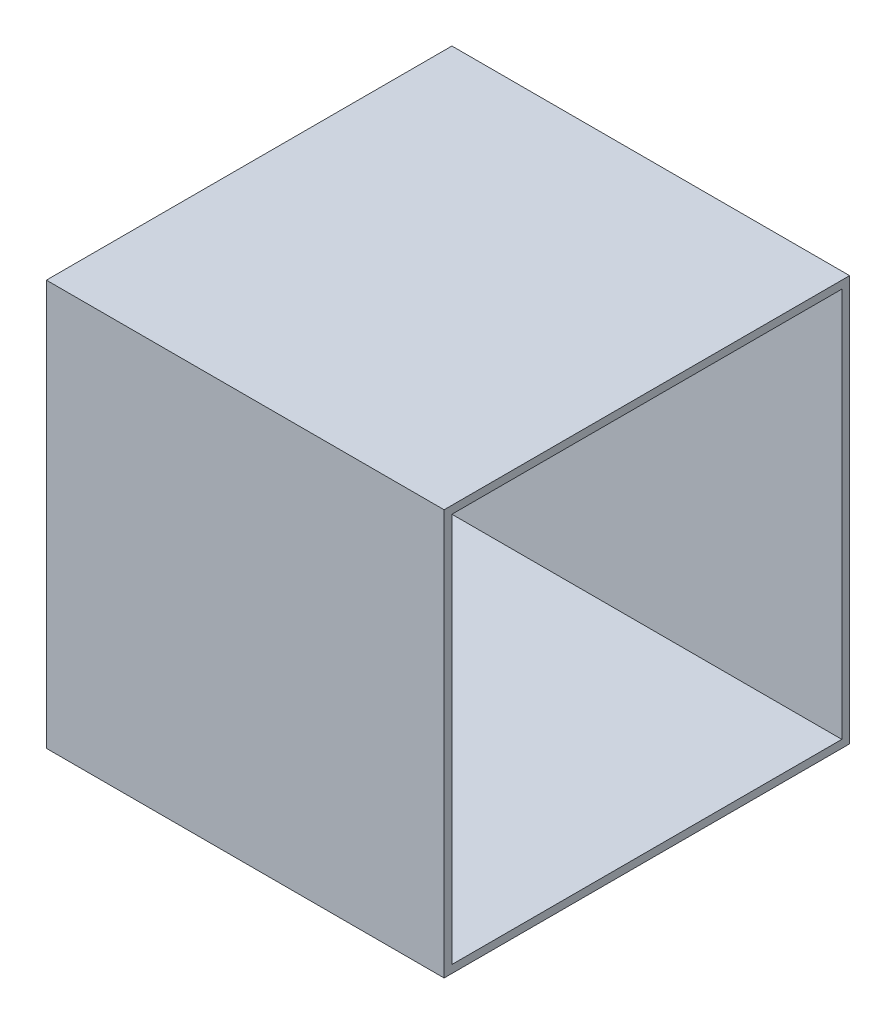
ISO-10303-21;
HEADER;
FILE_DESCRIPTION(('STEP AP214'),'2;1');
FILE_NAME('part.step','',(''),(''),'','','');
FILE_SCHEMA(('AUTOMOTIVE_DESIGN { 1 0 10303 214 1 1 1 1 }'));
ENDSEC;
DATA;
#1=APPLICATION_CONTEXT('core data for automotive mechanical design processes');
#2=APPLICATION_PROTOCOL_DEFINITION('international standard','automotive_design',2000,#1);
#3=PRODUCT_CONTEXT('',#1,'mechanical');
#4=PRODUCT('Part','Part','',(#3));
#5=PRODUCT_RELATED_PRODUCT_CATEGORY('part','',(#4));
#6=PRODUCT_DEFINITION_FORMATION('','',#4);
#7=PRODUCT_DEFINITION_CONTEXT('part definition',#1,'design');
#8=PRODUCT_DEFINITION('design','',#6,#7);
#9=PRODUCT_DEFINITION_SHAPE('','',#8);
#10=(LENGTH_UNIT() NAMED_UNIT(*) SI_UNIT(.MILLI.,.METRE.));
#11=(NAMED_UNIT(*) PLANE_ANGLE_UNIT() SI_UNIT($,.RADIAN.));
#12=(NAMED_UNIT(*) SI_UNIT($,.STERADIAN.) SOLID_ANGLE_UNIT());
#13=UNCERTAINTY_MEASURE_WITH_UNIT(LENGTH_MEASURE(1.E-05),#10,'distance_accuracy_value','');
#14=(GEOMETRIC_REPRESENTATION_CONTEXT(3) GLOBAL_UNCERTAINTY_ASSIGNED_CONTEXT((#13)) GLOBAL_UNIT_ASSIGNED_CONTEXT((#10,
#11,#12)) REPRESENTATION_CONTEXT('',''));
#15=CARTESIAN_POINT('',(0.,0.,0.));
#16=DIRECTION('',(0.,0.,1.));
#17=DIRECTION('',(1.,0.,0.));
#18=AXIS2_PLACEMENT_3D('',#15,#16,#17);
#19=CARTESIAN_POINT('',(-2.29436432934682,0.,0.));
#20=DIRECTION('',(-1.,0.,0.));
#21=DIRECTION('',(0.,0.,1.));
#22=AXIS2_PLACEMENT_3D('',#19,#20,#21);
#23=PLANE('',#22);
#24=DIRECTION('',(0.,1.,0.));
#25=VECTOR('',#24,1.);
#26=CARTESIAN_POINT('',(-2.29436432934682,0.,30.5));
#27=LINE('',#26,#25);
#28=CARTESIAN_POINT('',(-2.29436432934682,-21.0053870702622,30.5));
#29=VERTEX_POINT('',#28);
#30=CARTESIAN_POINT('',(-2.29436432934682,30.9946129297378,30.5));
#31=VERTEX_POINT('',#30);
#32=EDGE_CURVE('E169',#29,#31,#27,.T.);
#33=ORIENTED_EDGE('',*,*,#32,.T.);
#34=DIRECTION('',(0.,0.,-1.));
#35=VECTOR('',#34,1.);
#36=CARTESIAN_POINT('',(-2.29436432934682,30.9946129297378,0.));
#37=LINE('',#36,#35);
#38=CARTESIAN_POINT('',(-2.29436432934682,30.9946129297378,-21.5));
#39=VERTEX_POINT('',#38);
#40=EDGE_CURVE('E212',#31,#39,#37,.T.);
#41=ORIENTED_EDGE('',*,*,#40,.T.);
#42=DIRECTION('',(0.,-1.,0.));
#43=VECTOR('',#42,1.);
#44=CARTESIAN_POINT('',(-2.29436432934682,0.,-21.5));
#45=LINE('',#44,#43);
#46=CARTESIAN_POINT('',(-2.29436432934682,-21.0053870702622,-21.5));
#47=VERTEX_POINT('',#46);
#48=EDGE_CURVE('E214',#39,#47,#45,.T.);
#49=ORIENTED_EDGE('',*,*,#48,.T.);
#50=DIRECTION('',(0.,0.,1.));
#51=VECTOR('',#50,1.);
#52=CARTESIAN_POINT('',(-2.29436432934682,-21.0053870702622,0.));
#53=LINE('',#52,#51);
#54=EDGE_CURVE('E116',#47,#29,#53,.T.);
#55=ORIENTED_EDGE('',*,*,#54,.T.);
#56=EDGE_LOOP('',(#33,#41,#49,#55));
#57=FACE_BOUND('',#56,.T.);
#58=DIRECTION('',(0.,0.,-1.));
#59=VECTOR('',#58,1.);
#60=CARTESIAN_POINT('',(-2.29436432934682,29.9946129297378,-20.5));
#61=LINE('',#60,#59);
#62=CARTESIAN_POINT('',(-2.29436432934682,29.9946129297378,29.5));
#63=VERTEX_POINT('',#62);
#64=CARTESIAN_POINT('',(-2.29436432934682,29.9946129297378,-20.5));
#65=VERTEX_POINT('',#64);
#66=EDGE_CURVE('E201',#63,#65,#61,.T.);
#67=ORIENTED_EDGE('',*,*,#66,.F.);
#68=DIRECTION('',(0.,1.,0.));
#69=VECTOR('',#68,1.);
#70=CARTESIAN_POINT('',(-2.29436432934682,-20.0053870702622,29.5));
#71=LINE('',#70,#69);
#72=CARTESIAN_POINT('',(-2.29436432934682,-20.0053870702622,29.5));
#73=VERTEX_POINT('',#72);
#74=EDGE_CURVE('E166',#73,#63,#71,.T.);
#75=ORIENTED_EDGE('',*,*,#74,.F.);
#76=DIRECTION('',(0.,0.,1.));
#77=VECTOR('',#76,1.);
#78=CARTESIAN_POINT('',(-2.29436432934682,-20.0053870702622,-20.5));
#79=LINE('',#78,#77);
#80=CARTESIAN_POINT('',(-2.29436432934682,-20.0053870702622,-20.5));
#81=VERTEX_POINT('',#80);
#82=EDGE_CURVE('E205',#81,#73,#79,.T.);
#83=ORIENTED_EDGE('',*,*,#82,.F.);
#84=DIRECTION('',(0.,-1.,0.));
#85=VECTOR('',#84,1.);
#86=CARTESIAN_POINT('',(-2.29436432934682,-20.0053870702622,-20.5));
#87=LINE('',#86,#85);
#88=EDGE_CURVE('E203',#65,#81,#87,.T.);
#89=ORIENTED_EDGE('',*,*,#88,.F.);
#90=EDGE_LOOP('',(#67,#75,#83,#89));
#91=FACE_BOUND('',#90,.T.);
#92=ADVANCED_FACE('F93',(#57,#91),#23,.T.);
#93=CARTESIAN_POINT('',(-2.29436432934682,0.,30.5));
#94=DIRECTION('',(0.,0.,-1.));
#95=DIRECTION('',(-1.,0.,0.));
#96=AXIS2_PLACEMENT_3D('',#93,#94,#95);
#97=PLANE('',#96);
#98=DIRECTION('',(1.,0.,0.));
#99=VECTOR('',#98,1.);
#100=CARTESIAN_POINT('',(-2.29436432934682,-21.0053870702622,30.5));
#101=LINE('',#100,#99);
#102=CARTESIAN_POINT('',(48.7056356706532,-21.0053870702622,30.5));
#103=VERTEX_POINT('',#102);
#104=EDGE_CURVE('E217',#29,#103,#101,.T.);
#105=ORIENTED_EDGE('',*,*,#104,.T.);
#106=DIRECTION('',(0.,1.,0.));
#107=VECTOR('',#106,1.);
#108=CARTESIAN_POINT('',(48.7056356706532,0.,30.5));
#109=LINE('',#108,#107);
#110=CARTESIAN_POINT('',(48.7056356706532,30.9946129297378,30.5));
#111=VERTEX_POINT('',#110);
#112=EDGE_CURVE('E188',#103,#111,#109,.T.);
#113=ORIENTED_EDGE('',*,*,#112,.T.);
#114=DIRECTION('',(1.,0.,0.));
#115=VECTOR('',#114,1.);
#116=CARTESIAN_POINT('',(-2.29436432934682,30.9946129297378,30.5));
#117=LINE('',#116,#115);
#118=EDGE_CURVE('E13',#31,#111,#117,.T.);
#119=ORIENTED_EDGE('',*,*,#118,.F.);
#120=ORIENTED_EDGE('',*,*,#32,.F.);
#121=EDGE_LOOP('',(#105,#113,#119,#120));
#122=FACE_BOUND('',#121,.T.);
#123=ADVANCED_FACE('F95',(#122),#97,.F.);
#124=CARTESIAN_POINT('',(-2.29436432934682,30.9946129297378,0.));
#125=DIRECTION('',(0.,-1.,0.));
#126=DIRECTION('',(0.,0.,-1.));
#127=AXIS2_PLACEMENT_3D('',#124,#125,#126);
#128=PLANE('',#127);
#129=ORIENTED_EDGE('',*,*,#118,.T.);
#130=DIRECTION('',(0.,0.,-1.));
#131=VECTOR('',#130,1.);
#132=CARTESIAN_POINT('',(48.7056356706532,30.9946129297378,0.));
#133=LINE('',#132,#131);
#134=CARTESIAN_POINT('',(48.7056356706532,30.9946129297378,-21.5));
#135=VERTEX_POINT('',#134);
#136=EDGE_CURVE('E191',#111,#135,#133,.T.);
#137=ORIENTED_EDGE('',*,*,#136,.T.);
#138=DIRECTION('',(1.,0.,0.));
#139=VECTOR('',#138,1.);
#140=CARTESIAN_POINT('',(-2.29436432934682,30.9946129297378,-21.5));
#141=LINE('',#140,#139);
#142=EDGE_CURVE('E101',#39,#135,#141,.T.);
#143=ORIENTED_EDGE('',*,*,#142,.F.);
#144=ORIENTED_EDGE('',*,*,#40,.F.);
#145=EDGE_LOOP('',(#129,#137,#143,#144));
#146=FACE_BOUND('',#145,.T.);
#147=ADVANCED_FACE('F230',(#146),#128,.F.);
#148=CARTESIAN_POINT('',(-2.29436432934682,0.,-21.5));
#149=DIRECTION('',(0.,0.,1.));
#150=DIRECTION('',(1.,0.,0.));
#151=AXIS2_PLACEMENT_3D('',#148,#149,#150);
#152=PLANE('',#151);
#153=ORIENTED_EDGE('',*,*,#142,.T.);
#154=DIRECTION('',(0.,-1.,0.));
#155=VECTOR('',#154,1.);
#156=CARTESIAN_POINT('',(48.7056356706532,0.,-21.5));
#157=LINE('',#156,#155);
#158=CARTESIAN_POINT('',(48.7056356706532,-21.0053870702622,-21.5));
#159=VERTEX_POINT('',#158);
#160=EDGE_CURVE('E194',#135,#159,#157,.T.);
#161=ORIENTED_EDGE('',*,*,#160,.T.);
#162=DIRECTION('',(1.,0.,0.));
#163=VECTOR('',#162,1.);
#164=CARTESIAN_POINT('',(-2.29436432934682,-21.0053870702622,-21.5));
#165=LINE('',#164,#163);
#166=EDGE_CURVE('E219',#47,#159,#165,.T.);
#167=ORIENTED_EDGE('',*,*,#166,.F.);
#168=ORIENTED_EDGE('',*,*,#48,.F.);
#169=EDGE_LOOP('',(#153,#161,#167,#168));
#170=FACE_BOUND('',#169,.T.);
#171=ADVANCED_FACE('F224',(#170),#152,.F.);
#172=CARTESIAN_POINT('',(-2.29436432934682,-21.0053870702622,0.));
#173=DIRECTION('',(0.,1.,0.));
#174=DIRECTION('',(0.,0.,1.));
#175=AXIS2_PLACEMENT_3D('',#172,#173,#174);
#176=PLANE('',#175);
#177=ORIENTED_EDGE('',*,*,#166,.T.);
#178=DIRECTION('',(0.,0.,1.));
#179=VECTOR('',#178,1.);
#180=CARTESIAN_POINT('',(48.7056356706532,-21.0053870702622,0.));
#181=LINE('',#180,#179);
#182=EDGE_CURVE('E197',#159,#103,#181,.T.);
#183=ORIENTED_EDGE('',*,*,#182,.T.);
#184=ORIENTED_EDGE('',*,*,#104,.F.);
#185=ORIENTED_EDGE('',*,*,#54,.F.);
#186=EDGE_LOOP('',(#177,#183,#184,#185));
#187=FACE_BOUND('',#186,.T.);
#188=ADVANCED_FACE('F235',(#187),#176,.F.);
#189=CARTESIAN_POINT('',(-2.29436432934682,-20.0053870702622,29.5));
#190=DIRECTION('',(0.,0.,-1.));
#191=DIRECTION('',(-1.,0.,0.));
#192=AXIS2_PLACEMENT_3D('',#189,#190,#191);
#193=PLANE('',#192);
#194=DIRECTION('',(1.,0.,0.));
#195=VECTOR('',#194,1.);
#196=CARTESIAN_POINT('',(-2.29436432934682,29.9946129297378,29.5));
#197=LINE('',#196,#195);
#198=CARTESIAN_POINT('',(48.7056356706532,29.9946129297378,29.5));
#199=VERTEX_POINT('',#198);
#200=EDGE_CURVE('E158',#63,#199,#197,.T.);
#201=ORIENTED_EDGE('',*,*,#200,.T.);
#202=DIRECTION('',(0.,1.,0.));
#203=VECTOR('',#202,1.);
#204=CARTESIAN_POINT('',(48.7056356706532,-20.0053870702622,29.5));
#205=LINE('',#204,#203);
#206=CARTESIAN_POINT('',(48.7056356706532,-20.0053870702622,29.5));
#207=VERTEX_POINT('',#206);
#208=EDGE_CURVE('E163',#207,#199,#205,.T.);
#209=ORIENTED_EDGE('',*,*,#208,.F.);
#210=DIRECTION('',(1.,0.,0.));
#211=VECTOR('',#210,1.);
#212=CARTESIAN_POINT('',(-2.29436432934682,-20.0053870702622,29.5));
#213=LINE('',#212,#211);
#214=EDGE_CURVE('E207',#73,#207,#213,.T.);
#215=ORIENTED_EDGE('',*,*,#214,.F.);
#216=ORIENTED_EDGE('',*,*,#74,.T.);
#217=EDGE_LOOP('',(#201,#209,#215,#216));
#218=FACE_BOUND('',#217,.T.);
#219=ADVANCED_FACE('F160',(#218),#193,.T.);
#220=CARTESIAN_POINT('',(-2.29436432934682,29.9946129297378,-20.5));
#221=DIRECTION('',(0.,-1.,0.));
#222=DIRECTION('',(0.,0.,-1.));
#223=AXIS2_PLACEMENT_3D('',#220,#221,#222);
#224=PLANE('',#223);
#225=DIRECTION('',(1.,0.,0.));
#226=VECTOR('',#225,1.);
#227=CARTESIAN_POINT('',(-2.29436432934682,29.9946129297378,-20.5));
#228=LINE('',#227,#226);
#229=CARTESIAN_POINT('',(48.7056356706532,29.9946129297378,-20.5));
#230=VERTEX_POINT('',#229);
#231=EDGE_CURVE('E170',#65,#230,#228,.T.);
#232=ORIENTED_EDGE('',*,*,#231,.T.);
#233=DIRECTION('',(0.,0.,-1.));
#234=VECTOR('',#233,1.);
#235=CARTESIAN_POINT('',(48.7056356706532,29.9946129297378,-20.5));
#236=LINE('',#235,#234);
#237=EDGE_CURVE('E173',#199,#230,#236,.T.);
#238=ORIENTED_EDGE('',*,*,#237,.F.);
#239=ORIENTED_EDGE('',*,*,#200,.F.);
#240=ORIENTED_EDGE('',*,*,#66,.T.);
#241=EDGE_LOOP('',(#232,#238,#239,#240));
#242=FACE_BOUND('',#241,.T.);
#243=ADVANCED_FACE('F174',(#242),#224,.T.);
#244=CARTESIAN_POINT('',(-2.29436432934682,-20.0053870702622,-20.5));
#245=DIRECTION('',(0.,0.,1.));
#246=DIRECTION('',(1.,0.,0.));
#247=AXIS2_PLACEMENT_3D('',#244,#245,#246);
#248=PLANE('',#247);
#249=DIRECTION('',(1.,0.,0.));
#250=VECTOR('',#249,1.);
#251=CARTESIAN_POINT('',(-2.29436432934682,-20.0053870702622,-20.5));
#252=LINE('',#251,#250);
#253=CARTESIAN_POINT('',(48.7056356706532,-20.0053870702622,-20.5));
#254=VERTEX_POINT('',#253);
#255=EDGE_CURVE('E108',#81,#254,#252,.T.);
#256=ORIENTED_EDGE('',*,*,#255,.T.);
#257=DIRECTION('',(0.,-1.,0.));
#258=VECTOR('',#257,1.);
#259=CARTESIAN_POINT('',(48.7056356706532,-20.0053870702622,-20.5));
#260=LINE('',#259,#258);
#261=EDGE_CURVE('E179',#230,#254,#260,.T.);
#262=ORIENTED_EDGE('',*,*,#261,.F.);
#263=ORIENTED_EDGE('',*,*,#231,.F.);
#264=ORIENTED_EDGE('',*,*,#88,.T.);
#265=EDGE_LOOP('',(#256,#262,#263,#264));
#266=FACE_BOUND('',#265,.T.);
#267=ADVANCED_FACE('F253',(#266),#248,.T.);
#268=CARTESIAN_POINT('',(-2.29436432934682,-20.0053870702622,-20.5));
#269=DIRECTION('',(0.,1.,0.));
#270=DIRECTION('',(0.,0.,1.));
#271=AXIS2_PLACEMENT_3D('',#268,#269,#270);
#272=PLANE('',#271);
#273=ORIENTED_EDGE('',*,*,#214,.T.);
#274=DIRECTION('',(0.,0.,1.));
#275=VECTOR('',#274,1.);
#276=CARTESIAN_POINT('',(48.7056356706532,-20.0053870702622,-20.5));
#277=LINE('',#276,#275);
#278=EDGE_CURVE('E183',#254,#207,#277,.T.);
#279=ORIENTED_EDGE('',*,*,#278,.F.);
#280=ORIENTED_EDGE('',*,*,#255,.F.);
#281=ORIENTED_EDGE('',*,*,#82,.T.);
#282=EDGE_LOOP('',(#273,#279,#280,#281));
#283=FACE_BOUND('',#282,.T.);
#284=ADVANCED_FACE('F256',(#283),#272,.T.);
#285=CARTESIAN_POINT('',(48.7056356706532,0.,0.));
#286=DIRECTION('',(-1.,0.,0.));
#287=DIRECTION('',(0.,0.,1.));
#288=AXIS2_PLACEMENT_3D('',#285,#286,#287);
#289=PLANE('',#288);
#290=ORIENTED_EDGE('',*,*,#278,.T.);
#291=ORIENTED_EDGE('',*,*,#208,.T.);
#292=ORIENTED_EDGE('',*,*,#237,.T.);
#293=ORIENTED_EDGE('',*,*,#261,.T.);
#294=EDGE_LOOP('',(#290,#291,#292,#293));
#295=FACE_BOUND('',#294,.T.);
#296=ORIENTED_EDGE('',*,*,#112,.F.);
#297=ORIENTED_EDGE('',*,*,#182,.F.);
#298=ORIENTED_EDGE('',*,*,#160,.F.);
#299=ORIENTED_EDGE('',*,*,#136,.F.);
#300=EDGE_LOOP('',(#296,#297,#298,#299));
#301=FACE_BOUND('',#300,.T.);
#302=ADVANCED_FACE('F181',(#295,#301),#289,.F.);
#303=CLOSED_SHELL('',(#92,#123,#147,#171,#188,#219,#243,#267,#284,#302));
#304=MANIFOLD_SOLID_BREP('B2',#303);
#305=CARTESIAN_POINT('',(-1.29436432934682,0.,0.));
#306=DIRECTION('',(1.,0.,0.));
#307=DIRECTION('',(0.,0.,-1.));
#308=AXIS2_PLACEMENT_3D('',#305,#306,#307);
#309=PLANE('',#308);
#310=DIRECTION('',(0.,1.,0.));
#311=VECTOR('',#310,1.);
#312=CARTESIAN_POINT('',(-1.29436432934682,-20.0053870702622,29.5));
#313=LINE('',#312,#311);
#314=CARTESIAN_POINT('',(-1.29436432934682,-20.0053870702622,29.5));
#315=VERTEX_POINT('',#314);
#316=CARTESIAN_POINT('',(-1.29436432934682,29.9946129297378,29.5));
#317=VERTEX_POINT('',#316);
#318=EDGE_CURVE('E459',#315,#317,#313,.T.);
#319=ORIENTED_EDGE('',*,*,#318,.F.);
#320=DIRECTION('',(0.,0.,1.));
#321=VECTOR('',#320,1.);
#322=CARTESIAN_POINT('',(-1.29436432934682,-20.0053870702622,-20.5));
#323=LINE('',#322,#321);
#324=CARTESIAN_POINT('',(-1.29436432934682,-20.0053870702622,-20.5));
#325=VERTEX_POINT('',#324);
#326=EDGE_CURVE('E618',#325,#315,#323,.T.);
#327=ORIENTED_EDGE('',*,*,#326,.F.);
#328=DIRECTION('',(0.,-1.,0.));
#329=VECTOR('',#328,1.);
#330=CARTESIAN_POINT('',(-1.29436432934682,-20.0053870702622,-20.5));
#331=LINE('',#330,#329);
#332=CARTESIAN_POINT('',(-1.29436432934682,29.9946129297378,-20.5));
#333=VERTEX_POINT('',#332);
#334=EDGE_CURVE('E621',#333,#325,#331,.T.);
#335=ORIENTED_EDGE('',*,*,#334,.F.);
#336=DIRECTION('',(0.,0.,-1.));
#337=VECTOR('',#336,1.);
#338=CARTESIAN_POINT('',(-1.29436432934682,29.9946129297378,-20.5));
#339=LINE('',#338,#337);
#340=EDGE_CURVE('E623',#317,#333,#339,.T.);
#341=ORIENTED_EDGE('',*,*,#340,.F.);
#342=EDGE_LOOP('',(#319,#327,#335,#341));
#343=FACE_BOUND('',#342,.T.);
#344=DIRECTION('',(0.,0.,-1.));
#345=VECTOR('',#344,1.);
#346=CARTESIAN_POINT('',(-1.29436432934682,2.24461292973779,2.));
#347=LINE('',#346,#345);
#348=CARTESIAN_POINT('',(-1.29436432934682,2.24461292973779,2.));
#349=VERTEX_POINT('',#348);
#350=CARTESIAN_POINT('',(-1.29436432934682,2.24461292973779,-3.));
#351=VERTEX_POINT('',#350);
#352=EDGE_CURVE('E332',#349,#351,#347,.T.);
#353=ORIENTED_EDGE('',*,*,#352,.T.);
#354=DIRECTION('',(0.,-1.,0.));
#355=VECTOR('',#354,1.);
#356=CARTESIAN_POINT('',(-1.29436432934682,0.,-3.));
#357=LINE('',#356,#355);
#358=CARTESIAN_POINT('',(-1.29436432934682,-2.25538707026221,-3.));
#359=VERTEX_POINT('',#358);
#360=EDGE_CURVE('E460',#351,#359,#357,.T.);
#361=ORIENTED_EDGE('',*,*,#360,.T.);
#362=DIRECTION('',(0.,0.,-1.));
#363=VECTOR('',#362,1.);
#364=CARTESIAN_POINT('',(-1.29436432934682,-2.25538707026221,2.));
#365=LINE('',#364,#363);
#366=CARTESIAN_POINT('',(-1.29436432934682,-2.25538707026221,2.));
#367=VERTEX_POINT('',#366);
#368=EDGE_CURVE('E531',#367,#359,#365,.T.);
#369=ORIENTED_EDGE('',*,*,#368,.F.);
#370=DIRECTION('',(0.,-1.,0.));
#371=VECTOR('',#370,1.);
#372=CARTESIAN_POINT('',(-1.29436432934682,0.,2.));
#373=LINE('',#372,#371);
#374=EDGE_CURVE('E514',#349,#367,#373,.T.);
#375=ORIENTED_EDGE('',*,*,#374,.F.);
#376=EDGE_LOOP('',(#353,#361,#369,#375));
#377=FACE_BOUND('',#376,.T.);
#378=ADVANCED_FACE('F323',(#343,#377),#309,.T.);
#379=CARTESIAN_POINT('',(0.,0.,0.));
#380=DIRECTION('',(0.,0.,1.));
#381=DIRECTION('',(1.,0.,0.));
#382=AXIS2_PLACEMENT_3D('',#379,#380,#381);
#383=PLANE('',#382);
#384=CARTESIAN_POINT('',(-0.10260394639767,-0.00538707026220895,0.));
#385=DIRECTION('',(0.,0.,1.));
#386=DIRECTION('',(1.,0.,0.));
#387=AXIS2_PLACEMENT_3D('',#384,#385,#386);
#388=CIRCLE('',#387,0.3);
#389=CARTESIAN_POINT('',(0.19739605360233,-0.00538707026220895,0.));
#390=VERTEX_POINT('',#389);
#391=EDGE_CURVE('E523',#390,#390,#388,.T.);
#392=ORIENTED_EDGE('',*,*,#391,.T.);
#393=EDGE_LOOP('',(#392));
#394=FACE_BOUND('',#393,.T.);
#395=CARTESIAN_POINT('',(1.19739605360233,-0.00538707026220895,0.));
#396=DIRECTION('',(0.,0.,1.));
#397=DIRECTION('',(1.,0.,0.));
#398=AXIS2_PLACEMENT_3D('',#395,#396,#397);
#399=CIRCLE('',#398,0.3);
#400=CARTESIAN_POINT('',(1.49739605360233,-0.00538707026220895,0.));
#401=VERTEX_POINT('',#400);
#402=EDGE_CURVE('E486',#401,#401,#399,.T.);
#403=ORIENTED_EDGE('',*,*,#402,.T.);
#404=EDGE_LOOP('',(#403));
#405=FACE_BOUND('',#404,.T.);
#406=CARTESIAN_POINT('',(2.49739605360233,-0.00538707026220895,0.));
#407=DIRECTION('',(0.,0.,1.));
#408=DIRECTION('',(1.,0.,0.));
#409=AXIS2_PLACEMENT_3D('',#406,#407,#408);
#410=CIRCLE('',#409,0.3);
#411=CARTESIAN_POINT('',(2.79739605360233,-0.00538707026220895,0.));
#412=VERTEX_POINT('',#411);
#413=EDGE_CURVE('E483',#412,#412,#410,.T.);
#414=ORIENTED_EDGE('',*,*,#413,.T.);
#415=EDGE_LOOP('',(#414));
#416=FACE_BOUND('',#415,.T.);
#417=DIRECTION('',(1.,0.,0.));
#418=VECTOR('',#417,1.);
#419=CARTESIAN_POINT('',(0.,-1.25538707026221,0.));
#420=LINE('',#419,#418);
#421=CARTESIAN_POINT('',(-1.29436432934682,-1.25538707026221,0.));
#422=VERTEX_POINT('',#421);
#423=CARTESIAN_POINT('',(3.68915643655148,-1.25538707026221,0.));
#424=VERTEX_POINT('',#423);
#425=EDGE_CURVE('E479',#422,#424,#420,.T.);
#426=ORIENTED_EDGE('',*,*,#425,.F.);
#427=DIRECTION('',(0.,-1.,0.));
#428=VECTOR('',#427,1.);
#429=CARTESIAN_POINT('',(-1.29436432934682,0.,0.));
#430=LINE('',#429,#428);
#431=CARTESIAN_POINT('',(-1.29436432934682,1.24461292973779,0.));
#432=VERTEX_POINT('',#431);
#433=EDGE_CURVE('E493',#432,#422,#430,.T.);
#434=ORIENTED_EDGE('',*,*,#433,.F.);
#435=DIRECTION('',(1.,0.,0.));
#436=VECTOR('',#435,1.);
#437=CARTESIAN_POINT('',(0.,1.24461292973779,0.));
#438=LINE('',#437,#436);
#439=CARTESIAN_POINT('',(3.68915643655148,1.24461292973779,0.));
#440=VERTEX_POINT('',#439);
#441=EDGE_CURVE('E421',#432,#440,#438,.T.);
#442=ORIENTED_EDGE('',*,*,#441,.T.);
#443=DIRECTION('',(0.,-1.,0.));
#444=VECTOR('',#443,1.);
#445=CARTESIAN_POINT('',(3.68915643655148,0.,0.));
#446=LINE('',#445,#444);
#447=EDGE_CURVE('E348',#440,#424,#446,.T.);
#448=ORIENTED_EDGE('',*,*,#447,.T.);
#449=EDGE_LOOP('',(#426,#434,#442,#448));
#450=FACE_BOUND('',#449,.T.);
#451=ADVANCED_FACE('F551',(#394,#405,#416,#450),#383,.F.);
#452=CARTESIAN_POINT('',(3.68915643655148,0.,2.));
#453=DIRECTION('',(1.,0.,0.));
#454=DIRECTION('',(0.,1.,0.));
#455=AXIS2_PLACEMENT_3D('',#452,#453,#454);
#456=PLANE('',#455);
#457=DIRECTION('',(0.,-1.,0.));
#458=VECTOR('',#457,1.);
#459=CARTESIAN_POINT('',(3.68915643655148,0.,-3.));
#460=LINE('',#459,#458);
#461=CARTESIAN_POINT('',(3.68915643655148,2.24461292973779,-3.));
#462=VERTEX_POINT('',#461);
#463=CARTESIAN_POINT('',(3.68915643655148,-2.25538707026221,-3.));
#464=VERTEX_POINT('',#463);
#465=EDGE_CURVE('E466',#462,#464,#460,.T.);
#466=ORIENTED_EDGE('',*,*,#465,.F.);
#467=DIRECTION('',(0.,0.,-1.));
#468=VECTOR('',#467,1.);
#469=CARTESIAN_POINT('',(3.68915643655148,2.24461292973779,2.));
#470=LINE('',#469,#468);
#471=CARTESIAN_POINT('',(3.68915643655148,2.24461292973779,2.));
#472=VERTEX_POINT('',#471);
#473=EDGE_CURVE('E91',#472,#462,#470,.T.);
#474=ORIENTED_EDGE('',*,*,#473,.F.);
#475=DIRECTION('',(0.,-1.,0.));
#476=VECTOR('',#475,1.);
#477=CARTESIAN_POINT('',(3.68915643655148,0.,2.));
#478=LINE('',#477,#476);
#479=CARTESIAN_POINT('',(3.68915643655148,-2.25538707026221,2.));
#480=VERTEX_POINT('',#479);
#481=EDGE_CURVE('E508',#472,#480,#478,.T.);
#482=ORIENTED_EDGE('',*,*,#481,.T.);
#483=DIRECTION('',(0.,0.,-1.));
#484=VECTOR('',#483,1.);
#485=CARTESIAN_POINT('',(3.68915643655148,-2.25538707026221,2.));
#486=LINE('',#485,#484);
#487=EDGE_CURVE('E519',#480,#464,#486,.T.);
#488=ORIENTED_EDGE('',*,*,#487,.T.);
#489=EDGE_LOOP('',(#466,#474,#482,#488));
#490=FACE_BOUND('',#489,.T.);
#491=ORIENTED_EDGE('',*,*,#447,.F.);
#492=DIRECTION('',(0.,0.,1.));
#493=VECTOR('',#492,1.);
#494=CARTESIAN_POINT('',(3.68915643655148,1.24461292973779,-0.5));
#495=LINE('',#494,#493);
#496=CARTESIAN_POINT('',(3.68915643655148,1.24461292973779,-1.));
#497=VERTEX_POINT('',#496);
#498=EDGE_CURVE('E423',#497,#440,#495,.T.);
#499=ORIENTED_EDGE('',*,*,#498,.F.);
#500=DIRECTION('',(0.,-1.,0.));
#501=VECTOR('',#500,1.);
#502=CARTESIAN_POINT('',(3.68915643655148,0.,-1.));
#503=LINE('',#502,#501);
#504=CARTESIAN_POINT('',(3.68915643655148,-1.25538707026221,-1.));
#505=VERTEX_POINT('',#504);
#506=EDGE_CURVE('E430',#497,#505,#503,.T.);
#507=ORIENTED_EDGE('',*,*,#506,.T.);
#508=DIRECTION('',(0.,0.,1.));
#509=VECTOR('',#508,1.);
#510=CARTESIAN_POINT('',(3.68915643655148,-1.25538707026221,-0.5));
#511=LINE('',#510,#509);
#512=EDGE_CURVE('E478',#505,#424,#511,.T.);
#513=ORIENTED_EDGE('',*,*,#512,.T.);
#514=EDGE_LOOP('',(#491,#499,#507,#513));
#515=FACE_BOUND('',#514,.T.);
#516=ADVANCED_FACE('F482',(#490,#515),#456,.T.);
#517=CARTESIAN_POINT('',(0.,2.24461292973779,2.));
#518=DIRECTION('',(0.,-1.,0.));
#519=DIRECTION('',(1.,0.,0.));
#520=AXIS2_PLACEMENT_3D('',#517,#518,#519);
#521=PLANE('',#520);
#522=ORIENTED_EDGE('',*,*,#473,.T.);
#523=DIRECTION('',(-1.,0.,0.));
#524=VECTOR('',#523,1.);
#525=CARTESIAN_POINT('',(0.,2.24461292973779,-3.));
#526=LINE('',#525,#524);
#527=EDGE_CURVE('E463',#462,#351,#526,.T.);
#528=ORIENTED_EDGE('',*,*,#527,.T.);
#529=ORIENTED_EDGE('',*,*,#352,.F.);
#530=DIRECTION('',(-1.,0.,0.));
#531=VECTOR('',#530,1.);
#532=CARTESIAN_POINT('',(0.,2.24461292973779,2.));
#533=LINE('',#532,#531);
#534=EDGE_CURVE('E511',#472,#349,#533,.T.);
#535=ORIENTED_EDGE('',*,*,#534,.F.);
#536=EDGE_LOOP('',(#522,#528,#529,#535));
#537=FACE_BOUND('',#536,.T.);
#538=ADVANCED_FACE('F545',(#537),#521,.F.);
#539=CARTESIAN_POINT('',(-0.10260394639767,-0.00538707026220895,2.));
#540=DIRECTION('',(0.,0.,-1.));
#541=DIRECTION('',(-1.,0.,0.));
#542=AXIS2_PLACEMENT_3D('',#539,#540,#541);
#543=CYLINDRICAL_SURFACE('',#542,0.3);
#544=CARTESIAN_POINT('',(-0.10260394639767,-0.00538707026220895,2.));
#545=DIRECTION('',(0.,0.,1.));
#546=DIRECTION('',(1.,0.,0.));
#547=AXIS2_PLACEMENT_3D('',#544,#545,#546);
#548=CIRCLE('',#547,0.3);
#549=CARTESIAN_POINT('',(0.19739605360233,-0.00538707026220895,2.));
#550=VERTEX_POINT('',#549);
#551=EDGE_CURVE('E505',#550,#550,#548,.T.);
#552=ORIENTED_EDGE('',*,*,#551,.T.);
#553=EDGE_LOOP('',(#552));
#554=FACE_BOUND('',#553,.T.);
#555=ORIENTED_EDGE('',*,*,#391,.F.);
#556=EDGE_LOOP('',(#555));
#557=FACE_BOUND('',#556,.T.);
#558=ADVANCED_FACE('F585',(#554,#557),#543,.F.);
#559=CARTESIAN_POINT('',(1.19739605360233,-0.00538707026220895,2.));
#560=DIRECTION('',(0.,0.,-1.));
#561=DIRECTION('',(-1.,0.,0.));
#562=AXIS2_PLACEMENT_3D('',#559,#560,#561);
#563=CYLINDRICAL_SURFACE('',#562,0.3);
#564=CARTESIAN_POINT('',(1.19739605360233,-0.00538707026220895,2.));
#565=DIRECTION('',(0.,0.,1.));
#566=DIRECTION('',(1.,0.,0.));
#567=AXIS2_PLACEMENT_3D('',#564,#565,#566);
#568=CIRCLE('',#567,0.3);
#569=CARTESIAN_POINT('',(1.49739605360233,-0.00538707026220895,2.));
#570=VERTEX_POINT('',#569);
#571=EDGE_CURVE('E502',#570,#570,#568,.T.);
#572=ORIENTED_EDGE('',*,*,#571,.T.);
#573=EDGE_LOOP('',(#572));
#574=FACE_BOUND('',#573,.T.);
#575=ORIENTED_EDGE('',*,*,#402,.F.);
#576=EDGE_LOOP('',(#575));
#577=FACE_BOUND('',#576,.T.);
#578=ADVANCED_FACE('F589',(#574,#577),#563,.F.);
#579=CARTESIAN_POINT('',(2.49739605360233,-0.00538707026220895,2.));
#580=DIRECTION('',(0.,0.,-1.));
#581=DIRECTION('',(-1.,0.,0.));
#582=AXIS2_PLACEMENT_3D('',#579,#580,#581);
#583=CYLINDRICAL_SURFACE('',#582,0.3);
#584=CARTESIAN_POINT('',(2.49739605360233,-0.00538707026220895,2.));
#585=DIRECTION('',(0.,0.,1.));
#586=DIRECTION('',(1.,0.,0.));
#587=AXIS2_PLACEMENT_3D('',#584,#585,#586);
#588=CIRCLE('',#587,0.3);
#589=CARTESIAN_POINT('',(2.79739605360233,-0.00538707026220895,2.));
#590=VERTEX_POINT('',#589);
#591=EDGE_CURVE('E499',#590,#590,#588,.T.);
#592=ORIENTED_EDGE('',*,*,#591,.T.);
#593=EDGE_LOOP('',(#592));
#594=FACE_BOUND('',#593,.T.);
#595=ORIENTED_EDGE('',*,*,#413,.F.);
#596=EDGE_LOOP('',(#595));
#597=FACE_BOUND('',#596,.T.);
#598=ADVANCED_FACE('F325',(#594,#597),#583,.F.);
#599=CARTESIAN_POINT('',(0.,-2.25538707026221,2.));
#600=DIRECTION('',(0.,-1.,0.));
#601=DIRECTION('',(1.,0.,0.));
#602=AXIS2_PLACEMENT_3D('',#599,#600,#601);
#603=PLANE('',#602);
#604=ORIENTED_EDGE('',*,*,#368,.T.);
#605=DIRECTION('',(-1.,0.,0.));
#606=VECTOR('',#605,1.);
#607=CARTESIAN_POINT('',(0.,-2.25538707026221,-3.));
#608=LINE('',#607,#606);
#609=EDGE_CURVE('E456',#464,#359,#608,.T.);
#610=ORIENTED_EDGE('',*,*,#609,.F.);
#611=ORIENTED_EDGE('',*,*,#487,.F.);
#612=DIRECTION('',(-1.,0.,0.));
#613=VECTOR('',#612,1.);
#614=CARTESIAN_POINT('',(0.,-2.25538707026221,2.));
#615=LINE('',#614,#613);
#616=EDGE_CURVE('E517',#480,#367,#615,.T.);
#617=ORIENTED_EDGE('',*,*,#616,.T.);
#618=EDGE_LOOP('',(#604,#610,#611,#617));
#619=FACE_BOUND('',#618,.T.);
#620=ADVANCED_FACE('F538',(#619),#603,.T.);
#621=CARTESIAN_POINT('',(0.,0.,2.));
#622=DIRECTION('',(0.,0.,1.));
#623=DIRECTION('',(1.,0.,0.));
#624=AXIS2_PLACEMENT_3D('',#621,#622,#623);
#625=PLANE('',#624);
#626=ORIENTED_EDGE('',*,*,#591,.F.);
#627=EDGE_LOOP('',(#626));
#628=FACE_BOUND('',#627,.T.);
#629=ORIENTED_EDGE('',*,*,#571,.F.);
#630=EDGE_LOOP('',(#629));
#631=FACE_BOUND('',#630,.T.);
#632=ORIENTED_EDGE('',*,*,#551,.F.);
#633=EDGE_LOOP('',(#632));
#634=FACE_BOUND('',#633,.T.);
#635=ORIENTED_EDGE('',*,*,#481,.F.);
#636=ORIENTED_EDGE('',*,*,#534,.T.);
#637=ORIENTED_EDGE('',*,*,#374,.T.);
#638=ORIENTED_EDGE('',*,*,#616,.F.);
#639=EDGE_LOOP('',(#635,#636,#637,#638));
#640=FACE_BOUND('',#639,.T.);
#641=ADVANCED_FACE('F548',(#628,#631,#634,#640),#625,.T.);
#642=CARTESIAN_POINT('',(0.,1.24461292973779,-0.5));
#643=DIRECTION('',(0.,-1.,0.));
#644=DIRECTION('',(0.,0.,-1.));
#645=AXIS2_PLACEMENT_3D('',#642,#643,#644);
#646=PLANE('',#645);
#647=ORIENTED_EDGE('',*,*,#441,.F.);
#648=DIRECTION('',(0.,0.,1.));
#649=VECTOR('',#648,1.);
#650=CARTESIAN_POINT('',(-1.29436432934682,1.24461292973779,-0.5));
#651=LINE('',#650,#649);
#652=CARTESIAN_POINT('',(-1.29436432934682,1.24461292973779,-1.));
#653=VERTEX_POINT('',#652);
#654=EDGE_CURVE('E416',#653,#432,#651,.T.);
#655=ORIENTED_EDGE('',*,*,#654,.F.);
#656=DIRECTION('',(1.,0.,0.));
#657=VECTOR('',#656,1.);
#658=CARTESIAN_POINT('',(0.,1.24461292973779,-1.));
#659=LINE('',#658,#657);
#660=EDGE_CURVE('E419',#653,#497,#659,.T.);
#661=ORIENTED_EDGE('',*,*,#660,.T.);
#662=ORIENTED_EDGE('',*,*,#498,.T.);
#663=EDGE_LOOP('',(#647,#655,#661,#662));
#664=FACE_BOUND('',#663,.T.);
#665=ADVANCED_FACE('F418',(#664),#646,.T.);
#666=CARTESIAN_POINT('',(0.,-1.25538707026221,-0.5));
#667=DIRECTION('',(0.,-1.,0.));
#668=DIRECTION('',(0.,0.,-1.));
#669=AXIS2_PLACEMENT_3D('',#666,#667,#668);
#670=PLANE('',#669);
#671=ORIENTED_EDGE('',*,*,#425,.T.);
#672=ORIENTED_EDGE('',*,*,#512,.F.);
#673=DIRECTION('',(1.,0.,0.));
#674=VECTOR('',#673,1.);
#675=CARTESIAN_POINT('',(0.,-1.25538707026221,-1.));
#676=LINE('',#675,#674);
#677=CARTESIAN_POINT('',(-1.29436432934682,-1.25538707026221,-1.));
#678=VERTEX_POINT('',#677);
#679=EDGE_CURVE('E432',#678,#505,#676,.T.);
#680=ORIENTED_EDGE('',*,*,#679,.F.);
#681=DIRECTION('',(0.,0.,1.));
#682=VECTOR('',#681,1.);
#683=CARTESIAN_POINT('',(-1.29436432934682,-1.25538707026221,-0.5));
#684=LINE('',#683,#682);
#685=EDGE_CURVE('E340',#678,#422,#684,.T.);
#686=ORIENTED_EDGE('',*,*,#685,.T.);
#687=EDGE_LOOP('',(#671,#672,#680,#686));
#688=FACE_BOUND('',#687,.T.);
#689=ADVANCED_FACE('F476',(#688),#670,.F.);
#690=DIRECTION('',(0.,-1.,0.));
#691=VECTOR('',#690,1.);
#692=CARTESIAN_POINT('',(-1.29436432934682,0.,-1.));
#693=LINE('',#692,#691);
#694=EDGE_CURVE('E428',#653,#678,#693,.T.);
#695=ORIENTED_EDGE('',*,*,#694,.F.);
#696=ORIENTED_EDGE('',*,*,#654,.T.);
#697=ORIENTED_EDGE('',*,*,#433,.T.);
#698=ORIENTED_EDGE('',*,*,#685,.F.);
#699=EDGE_LOOP('',(#695,#696,#697,#698));
#700=FACE_BOUND('',#699,.T.);
#701=ADVANCED_FACE('F434',(#700),#309,.T.);
#702=CARTESIAN_POINT('',(-2.29436432934682,-20.0053870702622,29.5));
#703=DIRECTION('',(0.,0.,-1.));
#704=DIRECTION('',(-1.,0.,0.));
#705=AXIS2_PLACEMENT_3D('',#702,#703,#704);
#706=PLANE('',#705);
#707=ORIENTED_EDGE('',*,*,#318,.T.);
#708=DIRECTION('',(1.,0.,0.));
#709=VECTOR('',#708,1.);
#710=CARTESIAN_POINT('',(-2.29436432934682,29.9946129297378,29.5));
#711=LINE('',#710,#709);
#712=CARTESIAN_POINT('',(-2.29436432934682,29.9946129297378,29.5));
#713=VERTEX_POINT('',#712);
#714=EDGE_CURVE('E603',#713,#317,#711,.T.);
#715=ORIENTED_EDGE('',*,*,#714,.F.);
#716=DIRECTION('',(0.,1.,0.));
#717=VECTOR('',#716,1.);
#718=CARTESIAN_POINT('',(-2.29436432934682,-20.0053870702622,29.5));
#719=LINE('',#718,#717);
#720=CARTESIAN_POINT('',(-2.29436432934682,-20.0053870702622,29.5));
#721=VERTEX_POINT('',#720);
#722=EDGE_CURVE('E620',#721,#713,#719,.T.);
#723=ORIENTED_EDGE('',*,*,#722,.F.);
#724=DIRECTION('',(1.,0.,0.));
#725=VECTOR('',#724,1.);
#726=CARTESIAN_POINT('',(-2.29436432934682,-20.0053870702622,29.5));
#727=LINE('',#726,#725);
#728=EDGE_CURVE('E614',#721,#315,#727,.T.);
#729=ORIENTED_EDGE('',*,*,#728,.T.);
#730=EDGE_LOOP('',(#707,#715,#723,#729));
#731=FACE_BOUND('',#730,.T.);
#732=ADVANCED_FACE('F563',(#731),#706,.F.);
#733=CARTESIAN_POINT('',(-2.29436432934682,29.9946129297378,-20.5));
#734=DIRECTION('',(0.,-1.,0.));
#735=DIRECTION('',(0.,0.,-1.));
#736=AXIS2_PLACEMENT_3D('',#733,#734,#735);
#737=PLANE('',#736);
#738=ORIENTED_EDGE('',*,*,#340,.T.);
#739=DIRECTION('',(1.,0.,0.));
#740=VECTOR('',#739,1.);
#741=CARTESIAN_POINT('',(-2.29436432934682,29.9946129297378,-20.5));
#742=LINE('',#741,#740);
#743=CARTESIAN_POINT('',(-2.29436432934682,29.9946129297378,-20.5));
#744=VERTEX_POINT('',#743);
#745=EDGE_CURVE('E606',#744,#333,#742,.T.);
#746=ORIENTED_EDGE('',*,*,#745,.F.);
#747=DIRECTION('',(0.,0.,-1.));
#748=VECTOR('',#747,1.);
#749=CARTESIAN_POINT('',(-2.29436432934682,29.9946129297378,-20.5));
#750=LINE('',#749,#748);
#751=EDGE_CURVE('E630',#713,#744,#750,.T.);
#752=ORIENTED_EDGE('',*,*,#751,.F.);
#753=ORIENTED_EDGE('',*,*,#714,.T.);
#754=EDGE_LOOP('',(#738,#746,#752,#753));
#755=FACE_BOUND('',#754,.T.);
#756=ADVANCED_FACE('F568',(#755),#737,.F.);
#757=CARTESIAN_POINT('',(-2.29436432934682,-20.0053870702622,-20.5));
#758=DIRECTION('',(0.,0.,1.));
#759=DIRECTION('',(1.,0.,0.));
#760=AXIS2_PLACEMENT_3D('',#757,#758,#759);
#761=PLANE('',#760);
#762=ORIENTED_EDGE('',*,*,#334,.T.);
#763=DIRECTION('',(1.,0.,0.));
#764=VECTOR('',#763,1.);
#765=CARTESIAN_POINT('',(-2.29436432934682,-20.0053870702622,-20.5));
#766=LINE('',#765,#764);
#767=CARTESIAN_POINT('',(-2.29436432934682,-20.0053870702622,-20.5));
#768=VERTEX_POINT('',#767);
#769=EDGE_CURVE('E611',#768,#325,#766,.T.);
#770=ORIENTED_EDGE('',*,*,#769,.F.);
#771=DIRECTION('',(0.,-1.,0.));
#772=VECTOR('',#771,1.);
#773=CARTESIAN_POINT('',(-2.29436432934682,-20.0053870702622,-20.5));
#774=LINE('',#773,#772);
#775=EDGE_CURVE('E628',#744,#768,#774,.T.);
#776=ORIENTED_EDGE('',*,*,#775,.F.);
#777=ORIENTED_EDGE('',*,*,#745,.T.);
#778=EDGE_LOOP('',(#762,#770,#776,#777));
#779=FACE_BOUND('',#778,.T.);
#780=ADVANCED_FACE('F644',(#779),#761,.F.);
#781=CARTESIAN_POINT('',(-2.29436432934682,-20.0053870702622,-20.5));
#782=DIRECTION('',(0.,1.,0.));
#783=DIRECTION('',(0.,0.,1.));
#784=AXIS2_PLACEMENT_3D('',#781,#782,#783);
#785=PLANE('',#784);
#786=ORIENTED_EDGE('',*,*,#326,.T.);
#787=ORIENTED_EDGE('',*,*,#728,.F.);
#788=DIRECTION('',(0.,0.,1.));
#789=VECTOR('',#788,1.);
#790=CARTESIAN_POINT('',(-2.29436432934682,-20.0053870702622,-20.5));
#791=LINE('',#790,#789);
#792=EDGE_CURVE('E617',#768,#721,#791,.T.);
#793=ORIENTED_EDGE('',*,*,#792,.F.);
#794=ORIENTED_EDGE('',*,*,#769,.T.);
#795=EDGE_LOOP('',(#786,#787,#793,#794));
#796=FACE_BOUND('',#795,.T.);
#797=ADVANCED_FACE('F647',(#796),#785,.F.);
#798=CARTESIAN_POINT('',(-2.29436432934682,0.,0.));
#799=DIRECTION('',(1.,0.,0.));
#800=DIRECTION('',(0.,0.,-1.));
#801=AXIS2_PLACEMENT_3D('',#798,#799,#800);
#802=PLANE('',#801);
#803=ORIENTED_EDGE('',*,*,#722,.T.);
#804=ORIENTED_EDGE('',*,*,#751,.T.);
#805=ORIENTED_EDGE('',*,*,#775,.T.);
#806=ORIENTED_EDGE('',*,*,#792,.T.);
#807=EDGE_LOOP('',(#803,#804,#805,#806));
#808=FACE_BOUND('',#807,.T.);
#809=ADVANCED_FACE('F635',(#808),#802,.F.);
#810=CARTESIAN_POINT('',(0.,0.,-1.));
#811=DIRECTION('',(0.,0.,-1.));
#812=DIRECTION('',(1.,0.,0.));
#813=AXIS2_PLACEMENT_3D('',#810,#811,#812);
#814=PLANE('',#813);
#815=CARTESIAN_POINT('',(-0.10260394639767,-0.00538707026220895,-1.));
#816=DIRECTION('',(0.,0.,1.));
#817=DIRECTION('',(1.,0.,0.));
#818=AXIS2_PLACEMENT_3D('',#815,#816,#817);
#819=CIRCLE('',#818,0.3);
#820=CARTESIAN_POINT('',(0.19739605360233,-0.00538707026220895,-1.));
#821=VERTEX_POINT('',#820);
#822=EDGE_CURVE('E440',#821,#821,#819,.T.);
#823=ORIENTED_EDGE('',*,*,#822,.F.);
#824=EDGE_LOOP('',(#823));
#825=FACE_BOUND('',#824,.T.);
#826=CARTESIAN_POINT('',(1.19739605360233,-0.00538707026220895,-1.));
#827=DIRECTION('',(0.,0.,1.));
#828=DIRECTION('',(1.,0.,0.));
#829=AXIS2_PLACEMENT_3D('',#826,#827,#828);
#830=CIRCLE('',#829,0.3);
#831=CARTESIAN_POINT('',(1.49739605360233,-0.00538707026220895,-1.));
#832=VERTEX_POINT('',#831);
#833=EDGE_CURVE('E451',#832,#832,#830,.T.);
#834=ORIENTED_EDGE('',*,*,#833,.F.);
#835=EDGE_LOOP('',(#834));
#836=FACE_BOUND('',#835,.T.);
#837=CARTESIAN_POINT('',(2.49739605360233,-0.00538707026220895,-1.));
#838=DIRECTION('',(0.,0.,1.));
#839=DIRECTION('',(1.,0.,0.));
#840=AXIS2_PLACEMENT_3D('',#837,#838,#839);
#841=CIRCLE('',#840,0.3);
#842=CARTESIAN_POINT('',(2.79739605360233,-0.00538707026220895,-1.));
#843=VERTEX_POINT('',#842);
#844=EDGE_CURVE('E431',#843,#843,#841,.T.);
#845=ORIENTED_EDGE('',*,*,#844,.F.);
#846=EDGE_LOOP('',(#845));
#847=FACE_BOUND('',#846,.T.);
#848=ORIENTED_EDGE('',*,*,#679,.T.);
#849=ORIENTED_EDGE('',*,*,#506,.F.);
#850=ORIENTED_EDGE('',*,*,#660,.F.);
#851=ORIENTED_EDGE('',*,*,#694,.T.);
#852=EDGE_LOOP('',(#848,#849,#850,#851));
#853=FACE_BOUND('',#852,.T.);
#854=ADVANCED_FACE('F427',(#825,#836,#847,#853),#814,.F.);
#855=CARTESIAN_POINT('',(-0.10260394639767,-0.00538707026220895,-3.));
#856=DIRECTION('',(0.,0.,1.));
#857=DIRECTION('',(-1.,0.,0.));
#858=AXIS2_PLACEMENT_3D('',#855,#856,#857);
#859=CYLINDRICAL_SURFACE('',#858,0.3);
#860=CARTESIAN_POINT('',(-0.10260394639767,-0.00538707026220895,-3.));
#861=DIRECTION('',(0.,0.,1.));
#862=DIRECTION('',(1.,0.,0.));
#863=AXIS2_PLACEMENT_3D('',#860,#861,#862);
#864=CIRCLE('',#863,0.3);
#865=CARTESIAN_POINT('',(0.19739605360233,-0.00538707026220895,-3.));
#866=VERTEX_POINT('',#865);
#867=EDGE_CURVE('E469',#866,#866,#864,.T.);
#868=ORIENTED_EDGE('',*,*,#867,.F.);
#869=EDGE_LOOP('',(#868));
#870=FACE_BOUND('',#869,.T.);
#871=ORIENTED_EDGE('',*,*,#822,.T.);
#872=EDGE_LOOP('',(#871));
#873=FACE_BOUND('',#872,.T.);
#874=ADVANCED_FACE('F682',(#870,#873),#859,.F.);
#875=CARTESIAN_POINT('',(1.19739605360233,-0.00538707026220895,-3.));
#876=DIRECTION('',(0.,0.,1.));
#877=DIRECTION('',(-1.,0.,0.));
#878=AXIS2_PLACEMENT_3D('',#875,#876,#877);
#879=CYLINDRICAL_SURFACE('',#878,0.3);
#880=CARTESIAN_POINT('',(1.19739605360233,-0.00538707026220895,-3.));
#881=DIRECTION('',(0.,0.,1.));
#882=DIRECTION('',(1.,0.,0.));
#883=AXIS2_PLACEMENT_3D('',#880,#881,#882);
#884=CIRCLE('',#883,0.3);
#885=CARTESIAN_POINT('',(1.49739605360233,-0.00538707026220895,-3.));
#886=VERTEX_POINT('',#885);
#887=EDGE_CURVE('E438',#886,#886,#884,.T.);
#888=ORIENTED_EDGE('',*,*,#887,.F.);
#889=EDGE_LOOP('',(#888));
#890=FACE_BOUND('',#889,.T.);
#891=ORIENTED_EDGE('',*,*,#833,.T.);
#892=EDGE_LOOP('',(#891));
#893=FACE_BOUND('',#892,.T.);
#894=ADVANCED_FACE('F694',(#890,#893),#879,.F.);
#895=CARTESIAN_POINT('',(2.49739605360233,-0.00538707026220895,-3.));
#896=DIRECTION('',(0.,0.,1.));
#897=DIRECTION('',(-1.,0.,0.));
#898=AXIS2_PLACEMENT_3D('',#895,#896,#897);
#899=CYLINDRICAL_SURFACE('',#898,0.3);
#900=CARTESIAN_POINT('',(2.49739605360233,-0.00538707026220895,-3.));
#901=DIRECTION('',(0.,0.,1.));
#902=DIRECTION('',(1.,0.,0.));
#903=AXIS2_PLACEMENT_3D('',#900,#901,#902);
#904=CIRCLE('',#903,0.3);
#905=CARTESIAN_POINT('',(2.79739605360233,-0.00538707026220895,-3.));
#906=VERTEX_POINT('',#905);
#907=EDGE_CURVE('E435',#906,#906,#904,.T.);
#908=ORIENTED_EDGE('',*,*,#907,.F.);
#909=EDGE_LOOP('',(#908));
#910=FACE_BOUND('',#909,.T.);
#911=ORIENTED_EDGE('',*,*,#844,.T.);
#912=EDGE_LOOP('',(#911));
#913=FACE_BOUND('',#912,.T.);
#914=ADVANCED_FACE('F705',(#910,#913),#899,.F.);
#915=CARTESIAN_POINT('',(0.,0.,-3.));
#916=DIRECTION('',(0.,0.,-1.));
#917=DIRECTION('',(1.,0.,0.));
#918=AXIS2_PLACEMENT_3D('',#915,#916,#917);
#919=PLANE('',#918);
#920=ORIENTED_EDGE('',*,*,#907,.T.);
#921=EDGE_LOOP('',(#920));
#922=FACE_BOUND('',#921,.T.);
#923=ORIENTED_EDGE('',*,*,#887,.T.);
#924=EDGE_LOOP('',(#923));
#925=FACE_BOUND('',#924,.T.);
#926=ORIENTED_EDGE('',*,*,#867,.T.);
#927=EDGE_LOOP('',(#926));
#928=FACE_BOUND('',#927,.T.);
#929=ORIENTED_EDGE('',*,*,#465,.T.);
#930=ORIENTED_EDGE('',*,*,#609,.T.);
#931=ORIENTED_EDGE('',*,*,#360,.F.);
#932=ORIENTED_EDGE('',*,*,#527,.F.);
#933=EDGE_LOOP('',(#929,#930,#931,#932));
#934=FACE_BOUND('',#933,.T.);
#935=ADVANCED_FACE('F542',(#922,#925,#928,#934),#919,.T.);
#936=CLOSED_SHELL('',(#378,#451,#516,#538,#558,#578,#598,#620,#641,#665,#689,#701,#732,#756,
#780,#797,#809,#854,#874,#894,#914,#935));
#937=MANIFOLD_SOLID_BREP('B7',#936);
#938=ADVANCED_BREP_SHAPE_REPRESENTATION('',(#18,#304,#937),#14);
#939=SHAPE_DEFINITION_REPRESENTATION(#9,#938);
ENDSEC;
END-ISO-10303-21;
